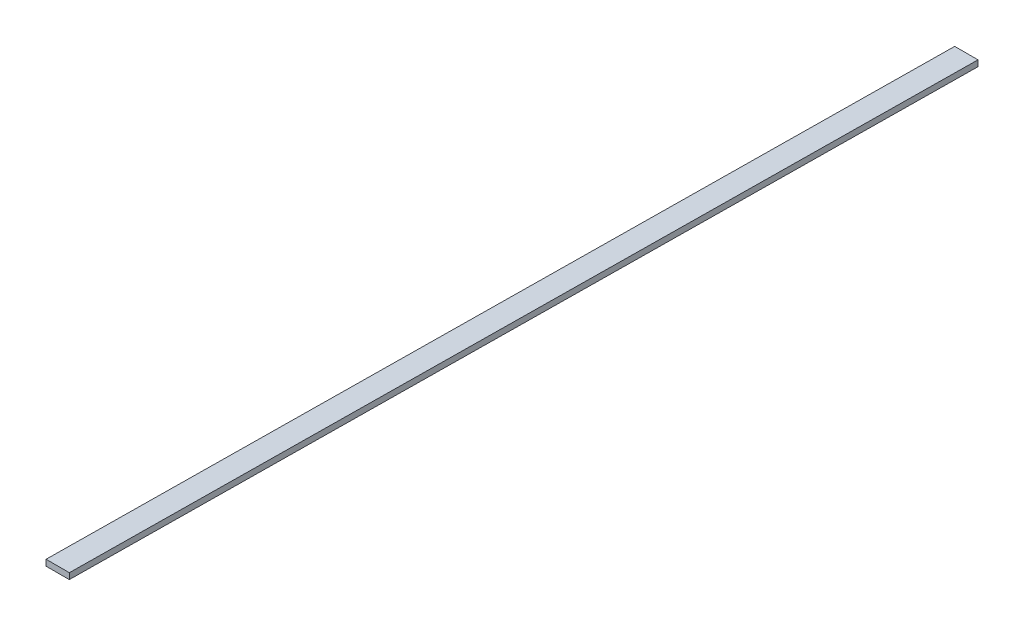
ISO-10303-21;
HEADER;
FILE_DESCRIPTION(('STEP AP214'),'2;1');
FILE_NAME('part.step','',(''),(''),'','','');
FILE_SCHEMA(('AUTOMOTIVE_DESIGN { 1 0 10303 214 1 1 1 1 }'));
ENDSEC;
DATA;
#1=APPLICATION_CONTEXT('core data for automotive mechanical design processes');
#2=APPLICATION_PROTOCOL_DEFINITION('international standard','automotive_design',2000,#1);
#3=PRODUCT_CONTEXT('',#1,'mechanical');
#4=PRODUCT('Part','Part','',(#3));
#5=PRODUCT_RELATED_PRODUCT_CATEGORY('part','',(#4));
#6=PRODUCT_DEFINITION_FORMATION('','',#4);
#7=PRODUCT_DEFINITION_CONTEXT('part definition',#1,'design');
#8=PRODUCT_DEFINITION('design','',#6,#7);
#9=PRODUCT_DEFINITION_SHAPE('','',#8);
#10=(LENGTH_UNIT() NAMED_UNIT(*) SI_UNIT(.MILLI.,.METRE.));
#11=(NAMED_UNIT(*) PLANE_ANGLE_UNIT() SI_UNIT($,.RADIAN.));
#12=(NAMED_UNIT(*) SI_UNIT($,.STERADIAN.) SOLID_ANGLE_UNIT());
#13=UNCERTAINTY_MEASURE_WITH_UNIT(LENGTH_MEASURE(1.E-05),#10,'distance_accuracy_value','');
#14=(GEOMETRIC_REPRESENTATION_CONTEXT(3) GLOBAL_UNCERTAINTY_ASSIGNED_CONTEXT((#13)) GLOBAL_UNIT_ASSIGNED_CONTEXT((#10,
#11,#12)) REPRESENTATION_CONTEXT('',''));
#15=CARTESIAN_POINT('',(0.,0.,0.));
#16=DIRECTION('',(0.,0.,1.));
#17=DIRECTION('',(1.,0.,0.));
#18=AXIS2_PLACEMENT_3D('',#15,#16,#17);
#19=CARTESIAN_POINT('',(257.051206630707,349.069511437359,-1497.55289267231));
#20=DIRECTION('',(-1.,0.,0.));
#21=DIRECTION('',(0.,0.,-1.));
#22=AXIS2_PLACEMENT_3D('',#19,#20,#21);
#23=PLANE('',#22);
#24=DIRECTION('',(0.,-0.0111918961883254,-0.999937368768519));
#25=VECTOR('',#24,1.);
#26=CARTESIAN_POINT('',(257.051206630707,353.831713156119,-1497.60619407791));
#27=LINE('',#26,#25);
#28=CARTESIAN_POINT('',(257.051206630713,361.898497769102,-776.88119407791));
#29=VERTEX_POINT('',#28);
#30=CARTESIAN_POINT('',(257.051206630706,353.796176660027,-1500.78119407791));
#31=VERTEX_POINT('',#30);
#32=EDGE_CURVE('E98',#29,#31,#27,.T.);
#33=ORIENTED_EDGE('',*,*,#32,.F.);
#34=DIRECTION('',(0.,0.999937368768519,-0.0111918961883221));
#35=VECTOR('',#34,1.);
#36=CARTESIAN_POINT('',(257.051206630713,357.136296050342,-776.827892672313));
#37=LINE('',#36,#35);
#38=CARTESIAN_POINT('',(257.051206630713,357.136296050342,-776.827892672313));
#39=VERTEX_POINT('',#38);
#40=EDGE_CURVE('E97',#39,#29,#37,.T.);
#41=ORIENTED_EDGE('',*,*,#40,.F.);
#42=DIRECTION('',(0.,-0.0111918961883262,-0.999937368768519));
#43=VECTOR('',#42,1.);
#44=CARTESIAN_POINT('',(257.051206630713,357.136296050342,-776.827892672313));
#45=LINE('',#44,#43);
#46=CARTESIAN_POINT('',(257.051206630706,349.033974941267,-1500.72789267231));
#47=VERTEX_POINT('',#46);
#48=EDGE_CURVE('E92',#39,#47,#45,.T.);
#49=ORIENTED_EDGE('',*,*,#48,.T.);
#50=DIRECTION('',(0.,0.999937368768519,-0.0111918961883221));
#51=VECTOR('',#50,1.);
#52=CARTESIAN_POINT('',(257.051206630706,349.033974941267,-1500.72789267231));
#53=LINE('',#52,#51);
#54=EDGE_CURVE('E11',#47,#31,#53,.T.);
#55=ORIENTED_EDGE('',*,*,#54,.T.);
#56=EDGE_LOOP('',(#33,#41,#49,#55));
#57=FACE_BOUND('',#56,.T.);
#58=ADVANCED_FACE('F35',(#57),#23,.F.);
#59=CARTESIAN_POINT('',(257.051206630706,349.033974941267,-1500.72789267231));
#60=DIRECTION('',(0.,0.0111918961883221,0.999937368768519));
#61=DIRECTION('',(0.,0.999937368768519,-0.0111918961883221));
#62=AXIS2_PLACEMENT_3D('',#59,#60,#61);
#63=PLANE('',#62);
#64=DIRECTION('',(-1.,0.,0.));
#65=VECTOR('',#64,1.);
#66=CARTESIAN_POINT('',(257.051206630706,353.796176660027,-1500.78119407791));
#67=LINE('',#66,#65);
#68=CARTESIAN_POINT('',(238.509206630706,353.796176660027,-1500.78119407791));
#69=VERTEX_POINT('',#68);
#70=EDGE_CURVE('E100',#31,#69,#67,.T.);
#71=ORIENTED_EDGE('',*,*,#70,.F.);
#72=ORIENTED_EDGE('',*,*,#54,.F.);
#73=DIRECTION('',(-1.,0.,0.));
#74=VECTOR('',#73,1.);
#75=CARTESIAN_POINT('',(257.051206630706,349.033974941267,-1500.72789267231));
#76=LINE('',#75,#74);
#77=CARTESIAN_POINT('',(238.509206630706,349.033974941267,-1500.72789267231));
#78=VERTEX_POINT('',#77);
#79=EDGE_CURVE('E76',#47,#78,#76,.T.);
#80=ORIENTED_EDGE('',*,*,#79,.T.);
#81=DIRECTION('',(0.,0.999937368768519,-0.0111918961883221));
#82=VECTOR('',#81,1.);
#83=CARTESIAN_POINT('',(238.509206630706,349.033974941267,-1500.72789267231));
#84=LINE('',#83,#82);
#85=EDGE_CURVE('E43',#78,#69,#84,.T.);
#86=ORIENTED_EDGE('',*,*,#85,.T.);
#87=EDGE_LOOP('',(#71,#72,#80,#86));
#88=FACE_BOUND('',#87,.T.);
#89=ADVANCED_FACE('F90',(#88),#63,.F.);
#90=CARTESIAN_POINT('',(238.509206630713,357.10075955425,-780.002892672313));
#91=DIRECTION('',(1.,0.,0.));
#92=DIRECTION('',(0.,0.,1.));
#93=AXIS2_PLACEMENT_3D('',#90,#91,#92);
#94=PLANE('',#93);
#95=DIRECTION('',(0.,0.0111918961883262,0.999937368768519));
#96=VECTOR('',#95,1.);
#97=CARTESIAN_POINT('',(238.509206630713,361.86296127301,-780.05619407791));
#98=LINE('',#97,#96);
#99=CARTESIAN_POINT('',(238.509206630713,361.898497769102,-776.88119407791));
#100=VERTEX_POINT('',#99);
#101=EDGE_CURVE('E86',#69,#100,#98,.T.);
#102=ORIENTED_EDGE('',*,*,#101,.F.);
#103=ORIENTED_EDGE('',*,*,#85,.F.);
#104=DIRECTION('',(0.,0.0111918961883246,0.999937368768519));
#105=VECTOR('',#104,1.);
#106=CARTESIAN_POINT('',(238.509206630706,349.033974941267,-1500.72789267231));
#107=LINE('',#106,#105);
#108=CARTESIAN_POINT('',(238.509206630713,357.136296050342,-776.827892672313));
#109=VERTEX_POINT('',#108);
#110=EDGE_CURVE('E79',#78,#109,#107,.T.);
#111=ORIENTED_EDGE('',*,*,#110,.T.);
#112=DIRECTION('',(0.,0.999937368768519,-0.0111918961883221));
#113=VECTOR('',#112,1.);
#114=CARTESIAN_POINT('',(238.509206630713,357.136296050342,-776.827892672313));
#115=LINE('',#114,#113);
#116=EDGE_CURVE('E89',#109,#100,#115,.T.);
#117=ORIENTED_EDGE('',*,*,#116,.T.);
#118=EDGE_LOOP('',(#102,#103,#111,#117));
#119=FACE_BOUND('',#118,.T.);
#120=ADVANCED_FACE('F85',(#119),#94,.F.);
#121=CARTESIAN_POINT('',(238.509206630713,357.136296050342,-776.827892672313));
#122=DIRECTION('',(0.,-0.0111918961883221,-0.999937368768519));
#123=DIRECTION('',(0.,-0.999937368768519,0.0111918961883221));
#124=AXIS2_PLACEMENT_3D('',#121,#122,#123);
#125=PLANE('',#124);
#126=DIRECTION('',(1.,0.,0.));
#127=VECTOR('',#126,1.);
#128=CARTESIAN_POINT('',(238.509206630713,361.898497769102,-776.88119407791));
#129=LINE('',#128,#127);
#130=EDGE_CURVE('E65',#100,#29,#129,.T.);
#131=ORIENTED_EDGE('',*,*,#130,.F.);
#132=ORIENTED_EDGE('',*,*,#116,.F.);
#133=DIRECTION('',(1.,0.,0.));
#134=VECTOR('',#133,1.);
#135=CARTESIAN_POINT('',(238.509206630713,357.136296050342,-776.827892672313));
#136=LINE('',#135,#134);
#137=EDGE_CURVE('E51',#109,#39,#136,.T.);
#138=ORIENTED_EDGE('',*,*,#137,.T.);
#139=ORIENTED_EDGE('',*,*,#40,.T.);
#140=EDGE_LOOP('',(#131,#132,#138,#139));
#141=FACE_BOUND('',#140,.T.);
#142=ADVANCED_FACE('F109',(#141),#125,.F.);
#143=CARTESIAN_POINT('',(0.,365.785194283182,-4.09408633931333));
#144=DIRECTION('',(0.,-0.999937368768519,0.0111918961883262));
#145=DIRECTION('',(0.,0.0111918961883262,0.999937368768519));
#146=AXIS2_PLACEMENT_3D('',#143,#144,#145);
#147=PLANE('',#146);
#148=ORIENTED_EDGE('',*,*,#48,.F.);
#149=ORIENTED_EDGE('',*,*,#137,.F.);
#150=ORIENTED_EDGE('',*,*,#110,.F.);
#151=ORIENTED_EDGE('',*,*,#79,.F.);
#152=EDGE_LOOP('',(#148,#149,#150,#151));
#153=FACE_BOUND('',#152,.T.);
#154=ADVANCED_FACE('F81',(#153),#147,.T.);
#155=CARTESIAN_POINT('',(0.,370.547396001942,-4.14738774491021));
#156=DIRECTION('',(0.,-0.999937368768519,0.0111918961883262));
#157=DIRECTION('',(0.,0.0111918961883262,0.999937368768519));
#158=AXIS2_PLACEMENT_3D('',#155,#156,#157);
#159=PLANE('',#158);
#160=ORIENTED_EDGE('',*,*,#32,.T.);
#161=ORIENTED_EDGE('',*,*,#70,.T.);
#162=ORIENTED_EDGE('',*,*,#101,.T.);
#163=ORIENTED_EDGE('',*,*,#130,.T.);
#164=EDGE_LOOP('',(#160,#161,#162,#163));
#165=FACE_BOUND('',#164,.T.);
#166=ADVANCED_FACE('F105',(#165),#159,.F.);
#167=CLOSED_SHELL('',(#58,#89,#120,#142,#154,#166));
#168=MANIFOLD_SOLID_BREP('B2',#167);
#169=ADVANCED_BREP_SHAPE_REPRESENTATION('',(#18,#168),#14);
#170=SHAPE_DEFINITION_REPRESENTATION(#9,#169);
ENDSEC;
END-ISO-10303-21;
